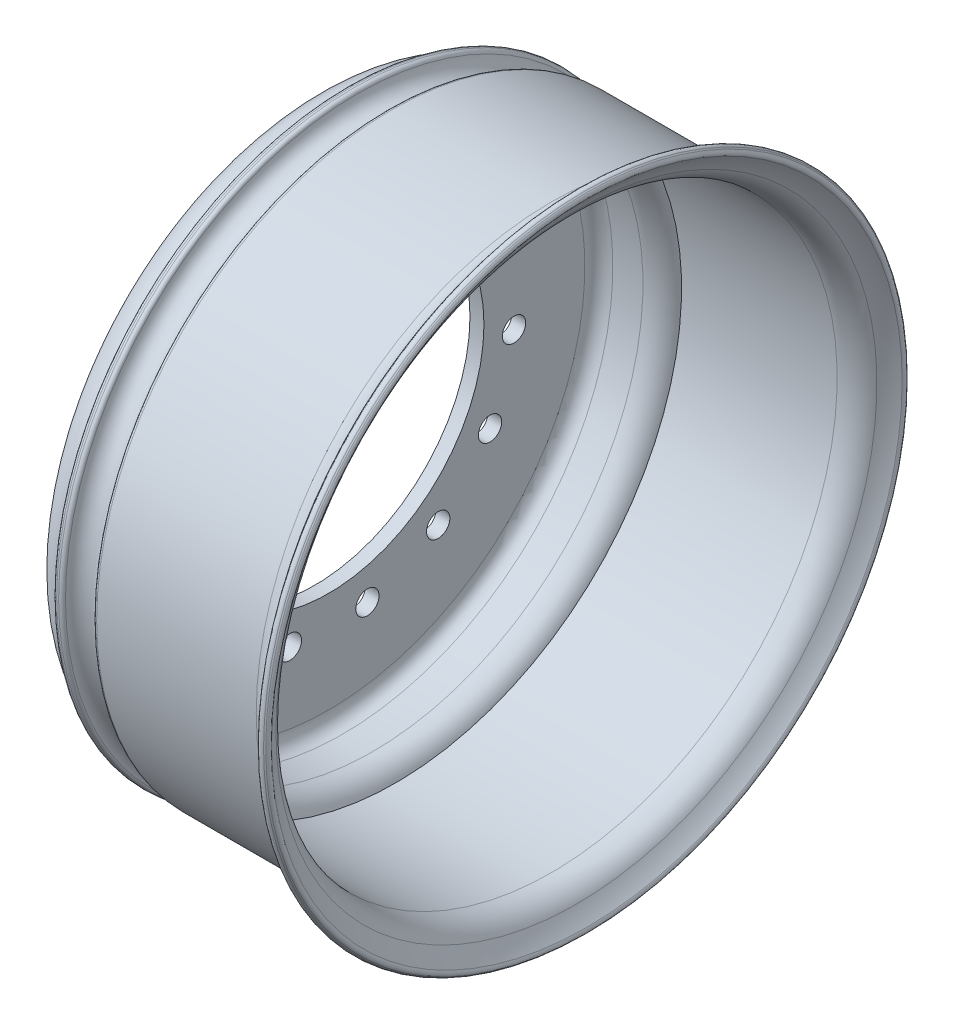
ISO-10303-21;
HEADER;
FILE_DESCRIPTION(('STEP AP214'),'2;1');
FILE_NAME('part.step','',(''),(''),'','','');
FILE_SCHEMA(('AUTOMOTIVE_DESIGN { 1 0 10303 214 1 1 1 1 }'));
ENDSEC;
DATA;
#1=APPLICATION_CONTEXT('core data for automotive mechanical design processes');
#2=APPLICATION_PROTOCOL_DEFINITION('international standard','automotive_design',2000,#1);
#3=PRODUCT_CONTEXT('',#1,'mechanical');
#4=PRODUCT('Part','Part','',(#3));
#5=PRODUCT_RELATED_PRODUCT_CATEGORY('part','',(#4));
#6=PRODUCT_DEFINITION_FORMATION('','',#4);
#7=PRODUCT_DEFINITION_CONTEXT('part definition',#1,'design');
#8=PRODUCT_DEFINITION('design','',#6,#7);
#9=PRODUCT_DEFINITION_SHAPE('','',#8);
#10=(LENGTH_UNIT() NAMED_UNIT(*) SI_UNIT(.MILLI.,.METRE.));
#11=(NAMED_UNIT(*) PLANE_ANGLE_UNIT() SI_UNIT($,.RADIAN.));
#12=(NAMED_UNIT(*) SI_UNIT($,.STERADIAN.) SOLID_ANGLE_UNIT());
#13=UNCERTAINTY_MEASURE_WITH_UNIT(LENGTH_MEASURE(1.E-05),#10,'distance_accuracy_value','');
#14=(GEOMETRIC_REPRESENTATION_CONTEXT(3) GLOBAL_UNCERTAINTY_ASSIGNED_CONTEXT((#13)) GLOBAL_UNIT_ASSIGNED_CONTEXT((#10,
#11,#12)) REPRESENTATION_CONTEXT('',''));
#15=CARTESIAN_POINT('',(0.,0.,0.));
#16=DIRECTION('',(0.,0.,1.));
#17=DIRECTION('',(1.,0.,0.));
#18=AXIS2_PLACEMENT_3D('',#15,#16,#17);
#19=CARTESIAN_POINT('',(0.,184.,0.));
#20=DIRECTION('',(1.,0.,0.));
#21=DIRECTION('',(0.,0.,-1.));
#22=AXIS2_PLACEMENT_3D('',#19,#20,#21);
#23=PLANE('',#22);
#24=CARTESIAN_POINT('',(0.,0.,0.));
#25=DIRECTION('',(1.,0.,0.));
#26=DIRECTION('',(0.,0.,-1.));
#27=AXIS2_PLACEMENT_3D('',#24,#25,#26);
#28=CIRCLE('',#27,187.5);
#29=CARTESIAN_POINT('',(0.,0.,-187.5));
#30=VERTEX_POINT('',#29);
#31=EDGE_CURVE('E44',#30,#30,#28,.F.);
#32=ORIENTED_EDGE('',*,*,#31,.T.);
#33=EDGE_LOOP('',(#32));
#34=FACE_BOUND('',#33,.T.);
#35=CARTESIAN_POINT('',(0.,0.,0.));
#36=DIRECTION('',(-1.,0.,0.));
#37=DIRECTION('',(0.,0.,1.));
#38=AXIS2_PLACEMENT_3D('',#35,#36,#37);
#39=CIRCLE('',#38,184.);
#40=CARTESIAN_POINT('',(0.,0.,184.));
#41=VERTEX_POINT('',#40);
#42=EDGE_CURVE('E84',#41,#41,#39,.T.);
#43=ORIENTED_EDGE('',*,*,#42,.F.);
#44=EDGE_LOOP('',(#43));
#45=FACE_BOUND('',#44,.T.);
#46=ADVANCED_FACE('F36',(#34,#45),#23,.F.);
#47=CARTESIAN_POINT('',(0.,0.,0.));
#48=DIRECTION('',(-1.,0.,0.));
#49=DIRECTION('',(0.,0.,1.));
#50=AXIS2_PLACEMENT_3D('',#47,#48,#49);
#51=CYLINDRICAL_SURFACE('',#50,184.);
#52=CARTESIAN_POINT('',(1.16760302580868,0.,0.));
#53=DIRECTION('',(-1.,0.,0.));
#54=DIRECTION('',(0.,0.,1.));
#55=AXIS2_PLACEMENT_3D('',#52,#53,#54);
#56=CIRCLE('',#55,184.);
#57=CARTESIAN_POINT('',(1.16760302580868,0.,184.));
#58=VERTEX_POINT('',#57);
#59=EDGE_CURVE('E94',#58,#58,#56,.T.);
#60=ORIENTED_EDGE('',*,*,#59,.F.);
#61=EDGE_LOOP('',(#60));
#62=FACE_BOUND('',#61,.T.);
#63=ORIENTED_EDGE('',*,*,#42,.T.);
#64=EDGE_LOOP('',(#63));
#65=FACE_BOUND('',#64,.T.);
#66=ADVANCED_FACE('F305',(#62,#65),#51,.F.);
#67=CARTESIAN_POINT('',(16.,0.,0.));
#68=DIRECTION('',(-1.,0.,0.));
#69=DIRECTION('',(0.,0.,1.));
#70=AXIS2_PLACEMENT_3D('',#67,#68,#69);
#71=TOROIDAL_SURFACE('',#70,190.,16.);
#72=CARTESIAN_POINT('',(1.61250543006184,0.,0.));
#73=DIRECTION('',(-1.,0.,0.));
#74=DIRECTION('',(0.,0.,1.));
#75=AXIS2_PLACEMENT_3D('',#72,#73,#74);
#76=CIRCLE('',#75,183.);
#77=CARTESIAN_POINT('',(1.61250543006184,0.,183.));
#78=VERTEX_POINT('',#77);
#79=EDGE_CURVE('E98',#78,#78,#76,.T.);
#80=ORIENTED_EDGE('',*,*,#79,.F.);
#81=EDGE_LOOP('',(#80));
#82=FACE_BOUND('',#81,.T.);
#83=ORIENTED_EDGE('',*,*,#59,.T.);
#84=EDGE_LOOP('',(#83));
#85=FACE_BOUND('',#84,.T.);
#86=ADVANCED_FACE('F299',(#82,#85),#71,.T.);
#87=CARTESIAN_POINT('',(0.,0.,0.));
#88=DIRECTION('',(-1.,0.,0.));
#89=DIRECTION('',(0.,0.,1.));
#90=AXIS2_PLACEMENT_3D('',#87,#88,#89);
#91=CYLINDRICAL_SURFACE('',#90,183.);
#92=CARTESIAN_POINT('',(-3.38749456993816,0.,0.));
#93=DIRECTION('',(-1.,0.,0.));
#94=DIRECTION('',(0.,0.,1.));
#95=AXIS2_PLACEMENT_3D('',#92,#93,#94);
#96=CIRCLE('',#95,183.);
#97=CARTESIAN_POINT('',(-3.38749456993816,0.,183.));
#98=VERTEX_POINT('',#97);
#99=EDGE_CURVE('E102',#98,#98,#96,.T.);
#100=ORIENTED_EDGE('',*,*,#99,.F.);
#101=EDGE_LOOP('',(#100));
#102=FACE_BOUND('',#101,.T.);
#103=ORIENTED_EDGE('',*,*,#79,.T.);
#104=EDGE_LOOP('',(#103));
#105=FACE_BOUND('',#104,.T.);
#106=ADVANCED_FACE('F293',(#102,#105),#91,.T.);
#107=CARTESIAN_POINT('',(-3.38749456993816,0.,0.));
#108=DIRECTION('',(-1.,0.,0.));
#109=DIRECTION('',(0.,0.,1.));
#110=AXIS2_PLACEMENT_3D('',#107,#108,#109);
#111=TOROIDAL_SURFACE('',#110,165.,18.);
#112=CARTESIAN_POINT('',(-21.3874945699382,0.,0.));
#113=DIRECTION('',(-1.,0.,0.));
#114=DIRECTION('',(0.,0.,1.));
#115=AXIS2_PLACEMENT_3D('',#112,#113,#114);
#116=CIRCLE('',#115,165.);
#117=CARTESIAN_POINT('',(-21.3874945699382,0.,165.));
#118=VERTEX_POINT('',#117);
#119=EDGE_CURVE('E106',#118,#118,#116,.T.);
#120=ORIENTED_EDGE('',*,*,#119,.F.);
#121=EDGE_LOOP('',(#120));
#122=FACE_BOUND('',#121,.T.);
#123=ORIENTED_EDGE('',*,*,#99,.T.);
#124=EDGE_LOOP('',(#123));
#125=FACE_BOUND('',#124,.T.);
#126=ADVANCED_FACE('F272',(#122,#125),#111,.T.);
#127=CARTESIAN_POINT('',(-21.3874945699382,100.,0.));
#128=DIRECTION('',(1.,0.,0.));
#129=DIRECTION('',(0.,0.,-1.));
#130=AXIS2_PLACEMENT_3D('',#127,#128,#129);
#131=PLANE('',#130);
#132=CARTESIAN_POINT('',(-21.3874945699382,80.2956727630628,-89.1773790572874));
#133=DIRECTION('',(-1.,0.,0.));
#134=DIRECTION('',(0.,0.743144825477395,0.669130606358857));
#135=AXIS2_PLACEMENT_3D('',#132,#133,#134);
#136=CIRCLE('',#135,7.5);
#137=CARTESIAN_POINT('',(-21.3874945699382,85.8692589541433,-84.158899509596));
#138=VERTEX_POINT('',#137);
#139=EDGE_CURVE('E215',#138,#138,#136,.T.);
#140=ORIENTED_EDGE('',*,*,#139,.F.);
#141=EDGE_LOOP('',(#140));
#142=FACE_BOUND('',#141,.T.);
#143=CARTESIAN_POINT('',(-21.3874945699382,37.0820393249934,-114.126781955419));
#144=DIRECTION('',(-1.,0.,0.));
#145=DIRECTION('',(0.,0.951056516295154,0.309016994374945));
#146=AXIS2_PLACEMENT_3D('',#143,#144,#145);
#147=CIRCLE('',#146,7.5);
#148=CARTESIAN_POINT('',(-21.3874945699382,44.2149631972071,-111.809154497606));
#149=VERTEX_POINT('',#148);
#150=EDGE_CURVE('E207',#149,#149,#147,.T.);
#151=ORIENTED_EDGE('',*,*,#150,.F.);
#152=EDGE_LOOP('',(#151));
#153=FACE_BOUND('',#152,.T.);
#154=CARTESIAN_POINT('',(-21.3874945699382,-12.5434155921188,-119.342627444193));
#155=DIRECTION('',(-1.,0.,0.));
#156=DIRECTION('',(0.,0.994521895368273,-0.104528463267657));
#157=AXIS2_PLACEMENT_3D('',#154,#155,#156);
#158=CIRCLE('',#157,7.5);
#159=CARTESIAN_POINT('',(-21.3874945699382,-5.08450137685675,-120.1265909187));
#160=VERTEX_POINT('',#159);
#161=EDGE_CURVE('E199',#160,#160,#158,.T.);
#162=ORIENTED_EDGE('',*,*,#161,.F.);
#163=EDGE_LOOP('',(#162));
#164=FACE_BOUND('',#163,.T.);
#165=CARTESIAN_POINT('',(-21.3874945699382,-60.0000000000004,-103.923048454132));
#166=DIRECTION('',(-1.,0.,0.));
#167=DIRECTION('',(0.,0.866025403784437,-0.500000000000003));
#168=AXIS2_PLACEMENT_3D('',#165,#166,#167);
#169=CIRCLE('',#168,7.5);
#170=CARTESIAN_POINT('',(-21.3874945699382,-53.5048094716171,-107.673048454132));
#171=VERTEX_POINT('',#170);
#172=EDGE_CURVE('E191',#171,#171,#169,.T.);
#173=ORIENTED_EDGE('',*,*,#172,.F.);
#174=EDGE_LOOP('',(#173));
#175=FACE_BOUND('',#174,.T.);
#176=CARTESIAN_POINT('',(-21.3874945699382,-97.082039324994,-70.5342302750963));
#177=DIRECTION('',(-1.,0.,0.));
#178=DIRECTION('',(0.,0.587785252292469,-0.80901699437495));
#179=AXIS2_PLACEMENT_3D('',#176,#177,#178);
#180=CIRCLE('',#179,7.5);
#181=CARTESIAN_POINT('',(-21.3874945699382,-92.6736499328005,-76.6018577329084));
#182=VERTEX_POINT('',#181);
#183=EDGE_CURVE('E183',#182,#182,#180,.T.);
#184=ORIENTED_EDGE('',*,*,#183,.F.);
#185=EDGE_LOOP('',(#184));
#186=FACE_BOUND('',#185,.T.);
#187=CARTESIAN_POINT('',(-21.3874945699382,-117.377712088057,-24.9494028981304));
#188=DIRECTION('',(-1.,0.,0.));
#189=DIRECTION('',(0.,0.207911690817754,-0.978147600733807));
#190=AXIS2_PLACEMENT_3D('',#187,#188,#189);
#191=CIRCLE('',#190,7.5);
#192=CARTESIAN_POINT('',(-21.3874945699382,-115.818374406924,-32.285509903634));
#193=VERTEX_POINT('',#192);
#194=EDGE_CURVE('E175',#193,#193,#191,.T.);
#195=ORIENTED_EDGE('',*,*,#194,.F.);
#196=EDGE_LOOP('',(#195));
#197=FACE_BOUND('',#196,.T.);
#198=CARTESIAN_POINT('',(-21.3874945699382,-117.377712088057,24.9494028981319));
#199=DIRECTION('',(-1.,0.,0.));
#200=DIRECTION('',(0.,-0.207911690817766,-0.978147600733804));
#201=AXIS2_PLACEMENT_3D('',#198,#199,#200);
#202=CIRCLE('',#201,7.5);
#203=CARTESIAN_POINT('',(-21.3874945699382,-118.93704976919,17.6132958926283));
#204=VERTEX_POINT('',#203);
#205=EDGE_CURVE('E165',#204,#204,#202,.T.);
#206=ORIENTED_EDGE('',*,*,#205,.F.);
#207=EDGE_LOOP('',(#206));
#208=FACE_BOUND('',#207,.T.);
#209=CARTESIAN_POINT('',(-21.3874945699382,-97.0820393249932,70.5342302750974));
#210=DIRECTION('',(-1.,0.,0.));
#211=DIRECTION('',(0.,-0.587785252292479,-0.809016994374943));
#212=AXIS2_PLACEMENT_3D('',#209,#210,#211);
#213=CIRCLE('',#212,7.5);
#214=CARTESIAN_POINT('',(-21.3874945699382,-101.490428717187,64.4666028172854));
#215=VERTEX_POINT('',#214);
#216=EDGE_CURVE('E166',#215,#215,#213,.T.);
#217=ORIENTED_EDGE('',*,*,#216,.F.);
#218=EDGE_LOOP('',(#217));
#219=FACE_BOUND('',#218,.T.);
#220=CARTESIAN_POINT('',(-21.3874945699382,-59.9999999999992,103.923048454133));
#221=DIRECTION('',(-1.,0.,0.));
#222=DIRECTION('',(0.,-0.866025403784443,-0.499999999999994));
#223=AXIS2_PLACEMENT_3D('',#220,#221,#222);
#224=CIRCLE('',#223,7.5);
#225=CARTESIAN_POINT('',(-21.3874945699382,-66.4951905283826,100.173048454133));
#226=VERTEX_POINT('',#225);
#227=EDGE_CURVE('E254',#226,#226,#224,.T.);
#228=ORIENTED_EDGE('',*,*,#227,.F.);
#229=EDGE_LOOP('',(#228));
#230=FACE_BOUND('',#229,.T.);
#231=CARTESIAN_POINT('',(-21.3874945699382,-12.5434155921173,119.342627444193));
#232=DIRECTION('',(-1.,0.,0.));
#233=DIRECTION('',(0.,-0.994521895368274,-0.104528463267645));
#234=AXIS2_PLACEMENT_3D('',#231,#232,#233);
#235=CIRCLE('',#234,7.5);
#236=CARTESIAN_POINT('',(-21.3874945699382,-20.0023298073794,118.558663969686));
#237=VERTEX_POINT('',#236);
#238=EDGE_CURVE('E246',#237,#237,#235,.T.);
#239=ORIENTED_EDGE('',*,*,#238,.F.);
#240=EDGE_LOOP('',(#239));
#241=FACE_BOUND('',#240,.T.);
#242=CARTESIAN_POINT('',(-21.3874945699382,37.0820393249948,114.126781955418));
#243=DIRECTION('',(-1.,0.,0.));
#244=DIRECTION('',(0.,-0.951056516295151,0.309016994374957));
#245=AXIS2_PLACEMENT_3D('',#242,#243,#244);
#246=CIRCLE('',#245,7.5);
#247=CARTESIAN_POINT('',(-21.3874945699382,29.9491154527812,116.44440941323));
#248=VERTEX_POINT('',#247);
#249=EDGE_CURVE('E238',#248,#248,#246,.T.);
#250=ORIENTED_EDGE('',*,*,#249,.F.);
#251=EDGE_LOOP('',(#250));
#252=FACE_BOUND('',#251,.T.);
#253=CARTESIAN_POINT('',(-21.3874945699382,80.2956727630639,89.1773790572865));
#254=DIRECTION('',(-1.,0.,0.));
#255=DIRECTION('',(0.,-0.743144825477387,0.669130606358866));
#256=AXIS2_PLACEMENT_3D('',#253,#254,#255);
#257=CIRCLE('',#256,7.5);
#258=CARTESIAN_POINT('',(-21.3874945699382,74.7220865719835,94.195858604978));
#259=VERTEX_POINT('',#258);
#260=EDGE_CURVE('E229',#259,#259,#257,.T.);
#261=ORIENTED_EDGE('',*,*,#260,.F.);
#262=EDGE_LOOP('',(#261));
#263=FACE_BOUND('',#262,.T.);
#264=CARTESIAN_POINT('',(-21.3874945699382,109.625454917113,48.8083971690947));
#265=DIRECTION('',(-1.,0.,0.));
#266=DIRECTION('',(0.,-0.40673664307579,0.913545457642606));
#267=AXIS2_PLACEMENT_3D('',#264,#265,#266);
#268=CIRCLE('',#267,7.5);
#269=CARTESIAN_POINT('',(-21.3874945699382,106.574930094044,55.6599881014143));
#270=VERTEX_POINT('',#269);
#271=EDGE_CURVE('E230',#270,#270,#268,.T.);
#272=ORIENTED_EDGE('',*,*,#271,.F.);
#273=EDGE_LOOP('',(#272));
#274=FACE_BOUND('',#273,.T.);
#275=CARTESIAN_POINT('',(-21.3874945699382,109.625454917112,-48.8083971690961));
#276=DIRECTION('',(-1.,0.,0.));
#277=DIRECTION('',(0.,0.406736643075801,0.913545457642601));
#278=AXIS2_PLACEMENT_3D('',#275,#276,#277);
#279=CIRCLE('',#278,7.5);
#280=CARTESIAN_POINT('',(-21.3874945699382,112.675979740181,-41.9568062367766));
#281=VERTEX_POINT('',#280);
#282=EDGE_CURVE('E156',#281,#281,#279,.T.);
#283=ORIENTED_EDGE('',*,*,#282,.F.);
#284=EDGE_LOOP('',(#283));
#285=FACE_BOUND('',#284,.T.);
#286=CARTESIAN_POINT('',(-21.3874945699382,120.,0.));
#287=DIRECTION('',(-1.,0.,0.));
#288=DIRECTION('',(0.,0.,1.));
#289=AXIS2_PLACEMENT_3D('',#286,#287,#288);
#290=CIRCLE('',#289,7.5);
#291=CARTESIAN_POINT('',(-21.3874945699382,120.,7.5));
#292=VERTEX_POINT('',#291);
#293=EDGE_CURVE('E90',#292,#292,#290,.T.);
#294=ORIENTED_EDGE('',*,*,#293,.F.);
#295=EDGE_LOOP('',(#294));
#296=FACE_BOUND('',#295,.T.);
#297=CARTESIAN_POINT('',(-21.3874945699382,0.,0.));
#298=DIRECTION('',(-1.,0.,0.));
#299=DIRECTION('',(0.,0.,1.));
#300=AXIS2_PLACEMENT_3D('',#297,#298,#299);
#301=CIRCLE('',#300,100.);
#302=CARTESIAN_POINT('',(-21.3874945699382,0.,100.));
#303=VERTEX_POINT('',#302);
#304=EDGE_CURVE('E110',#303,#303,#301,.T.);
#305=ORIENTED_EDGE('',*,*,#304,.F.);
#306=EDGE_LOOP('',(#305));
#307=FACE_BOUND('',#306,.T.);
#308=ORIENTED_EDGE('',*,*,#119,.T.);
#309=EDGE_LOOP('',(#308));
#310=FACE_BOUND('',#309,.T.);
#311=ADVANCED_FACE('F268',(#142,#153,#164,#175,#186,#197,#208,#219,#230,#241,#252,#263,#274,
#285,#296,#307,#310),#131,.F.);
#312=CARTESIAN_POINT('',(0.,0.,0.));
#313=DIRECTION('',(-1.,0.,0.));
#314=DIRECTION('',(0.,0.,1.));
#315=AXIS2_PLACEMENT_3D('',#312,#313,#314);
#316=CYLINDRICAL_SURFACE('',#315,100.);
#317=CARTESIAN_POINT('',(-12.3874945699381,0.,0.));
#318=DIRECTION('',(-1.,0.,0.));
#319=DIRECTION('',(0.,0.,1.));
#320=AXIS2_PLACEMENT_3D('',#317,#318,#319);
#321=CIRCLE('',#320,100.);
#322=CARTESIAN_POINT('',(-12.3874945699381,0.,100.));
#323=VERTEX_POINT('',#322);
#324=EDGE_CURVE('E114',#323,#323,#321,.T.);
#325=ORIENTED_EDGE('',*,*,#324,.F.);
#326=EDGE_LOOP('',(#325));
#327=FACE_BOUND('',#326,.T.);
#328=ORIENTED_EDGE('',*,*,#304,.T.);
#329=EDGE_LOOP('',(#328));
#330=FACE_BOUND('',#329,.T.);
#331=ADVANCED_FACE('F271',(#327,#330),#316,.F.);
#332=CARTESIAN_POINT('',(-12.3874945699382,165.,0.));
#333=DIRECTION('',(-1.,0.,0.));
#334=DIRECTION('',(0.,0.,1.));
#335=AXIS2_PLACEMENT_3D('',#332,#333,#334);
#336=PLANE('',#335);
#337=CARTESIAN_POINT('',(-12.3874945699382,80.2956727630628,-89.1773790572874));
#338=DIRECTION('',(-1.,0.,0.));
#339=DIRECTION('',(0.,0.743144825477395,0.669130606358857));
#340=AXIS2_PLACEMENT_3D('',#337,#338,#339);
#341=CIRCLE('',#340,7.5);
#342=CARTESIAN_POINT('',(-12.3874945699382,85.8692589541433,-84.158899509596));
#343=VERTEX_POINT('',#342);
#344=EDGE_CURVE('E160',#343,#343,#341,.T.);
#345=ORIENTED_EDGE('',*,*,#344,.T.);
#346=EDGE_LOOP('',(#345));
#347=FACE_BOUND('',#346,.T.);
#348=CARTESIAN_POINT('',(-12.3874945699382,37.0820393249934,-114.126781955419));
#349=DIRECTION('',(-1.,0.,0.));
#350=DIRECTION('',(0.,0.951056516295154,0.309016994374945));
#351=AXIS2_PLACEMENT_3D('',#348,#349,#350);
#352=CIRCLE('',#351,7.5);
#353=CARTESIAN_POINT('',(-12.3874945699382,44.2149631972071,-111.809154497606));
#354=VERTEX_POINT('',#353);
#355=EDGE_CURVE('E211',#354,#354,#352,.T.);
#356=ORIENTED_EDGE('',*,*,#355,.T.);
#357=EDGE_LOOP('',(#356));
#358=FACE_BOUND('',#357,.T.);
#359=CARTESIAN_POINT('',(-12.3874945699382,-12.5434155921188,-119.342627444193));
#360=DIRECTION('',(-1.,0.,0.));
#361=DIRECTION('',(0.,0.994521895368273,-0.104528463267657));
#362=AXIS2_PLACEMENT_3D('',#359,#360,#361);
#363=CIRCLE('',#362,7.5);
#364=CARTESIAN_POINT('',(-12.3874945699382,-5.08450137685675,-120.1265909187));
#365=VERTEX_POINT('',#364);
#366=EDGE_CURVE('E203',#365,#365,#363,.T.);
#367=ORIENTED_EDGE('',*,*,#366,.T.);
#368=EDGE_LOOP('',(#367));
#369=FACE_BOUND('',#368,.T.);
#370=CARTESIAN_POINT('',(-12.3874945699382,-60.0000000000004,-103.923048454132));
#371=DIRECTION('',(-1.,0.,0.));
#372=DIRECTION('',(0.,0.866025403784437,-0.500000000000003));
#373=AXIS2_PLACEMENT_3D('',#370,#371,#372);
#374=CIRCLE('',#373,7.5);
#375=CARTESIAN_POINT('',(-12.3874945699382,-53.5048094716171,-107.673048454132));
#376=VERTEX_POINT('',#375);
#377=EDGE_CURVE('E195',#376,#376,#374,.T.);
#378=ORIENTED_EDGE('',*,*,#377,.T.);
#379=EDGE_LOOP('',(#378));
#380=FACE_BOUND('',#379,.T.);
#381=CARTESIAN_POINT('',(-12.3874945699382,-97.082039324994,-70.5342302750963));
#382=DIRECTION('',(-1.,0.,0.));
#383=DIRECTION('',(0.,0.587785252292469,-0.80901699437495));
#384=AXIS2_PLACEMENT_3D('',#381,#382,#383);
#385=CIRCLE('',#384,7.5);
#386=CARTESIAN_POINT('',(-12.3874945699382,-92.6736499328005,-76.6018577329084));
#387=VERTEX_POINT('',#386);
#388=EDGE_CURVE('E187',#387,#387,#385,.T.);
#389=ORIENTED_EDGE('',*,*,#388,.T.);
#390=EDGE_LOOP('',(#389));
#391=FACE_BOUND('',#390,.T.);
#392=CARTESIAN_POINT('',(-12.3874945699382,-117.377712088057,-24.9494028981304));
#393=DIRECTION('',(-1.,0.,0.));
#394=DIRECTION('',(0.,0.207911690817754,-0.978147600733807));
#395=AXIS2_PLACEMENT_3D('',#392,#393,#394);
#396=CIRCLE('',#395,7.5);
#397=CARTESIAN_POINT('',(-12.3874945699382,-115.818374406924,-32.285509903634));
#398=VERTEX_POINT('',#397);
#399=EDGE_CURVE('E179',#398,#398,#396,.T.);
#400=ORIENTED_EDGE('',*,*,#399,.T.);
#401=EDGE_LOOP('',(#400));
#402=FACE_BOUND('',#401,.T.);
#403=CARTESIAN_POINT('',(-12.3874945699382,-117.377712088057,24.9494028981319));
#404=DIRECTION('',(-1.,0.,0.));
#405=DIRECTION('',(0.,-0.207911690817766,-0.978147600733804));
#406=AXIS2_PLACEMENT_3D('',#403,#404,#405);
#407=CIRCLE('',#406,7.5);
#408=CARTESIAN_POINT('',(-12.3874945699382,-118.93704976919,17.6132958926283));
#409=VERTEX_POINT('',#408);
#410=EDGE_CURVE('E171',#409,#409,#407,.T.);
#411=ORIENTED_EDGE('',*,*,#410,.T.);
#412=EDGE_LOOP('',(#411));
#413=FACE_BOUND('',#412,.T.);
#414=CARTESIAN_POINT('',(-12.3874945699382,-97.0820393249932,70.5342302750974));
#415=DIRECTION('',(-1.,0.,0.));
#416=DIRECTION('',(0.,-0.587785252292479,-0.809016994374943));
#417=AXIS2_PLACEMENT_3D('',#414,#415,#416);
#418=CIRCLE('',#417,7.5);
#419=CARTESIAN_POINT('',(-12.3874945699382,-101.490428717187,64.4666028172854));
#420=VERTEX_POINT('',#419);
#421=EDGE_CURVE('E161',#420,#420,#418,.T.);
#422=ORIENTED_EDGE('',*,*,#421,.T.);
#423=EDGE_LOOP('',(#422));
#424=FACE_BOUND('',#423,.T.);
#425=CARTESIAN_POINT('',(-12.3874945699382,-59.9999999999992,103.923048454133));
#426=DIRECTION('',(-1.,0.,0.));
#427=DIRECTION('',(0.,-0.866025403784443,-0.499999999999994));
#428=AXIS2_PLACEMENT_3D('',#425,#426,#427);
#429=CIRCLE('',#428,7.5);
#430=CARTESIAN_POINT('',(-12.3874945699382,-66.4951905283826,100.173048454133));
#431=VERTEX_POINT('',#430);
#432=EDGE_CURVE('E170',#431,#431,#429,.T.);
#433=ORIENTED_EDGE('',*,*,#432,.T.);
#434=EDGE_LOOP('',(#433));
#435=FACE_BOUND('',#434,.T.);
#436=CARTESIAN_POINT('',(-12.3874945699382,-12.5434155921173,119.342627444193));
#437=DIRECTION('',(-1.,0.,0.));
#438=DIRECTION('',(0.,-0.994521895368274,-0.104528463267645));
#439=AXIS2_PLACEMENT_3D('',#436,#437,#438);
#440=CIRCLE('',#439,7.5);
#441=CARTESIAN_POINT('',(-12.3874945699382,-20.0023298073794,118.558663969686));
#442=VERTEX_POINT('',#441);
#443=EDGE_CURVE('E250',#442,#442,#440,.T.);
#444=ORIENTED_EDGE('',*,*,#443,.T.);
#445=EDGE_LOOP('',(#444));
#446=FACE_BOUND('',#445,.T.);
#447=CARTESIAN_POINT('',(-12.3874945699382,37.0820393249948,114.126781955418));
#448=DIRECTION('',(-1.,0.,0.));
#449=DIRECTION('',(0.,-0.951056516295151,0.309016994374957));
#450=AXIS2_PLACEMENT_3D('',#447,#448,#449);
#451=CIRCLE('',#450,7.5);
#452=CARTESIAN_POINT('',(-12.3874945699382,29.9491154527812,116.44440941323));
#453=VERTEX_POINT('',#452);
#454=EDGE_CURVE('E242',#453,#453,#451,.T.);
#455=ORIENTED_EDGE('',*,*,#454,.T.);
#456=EDGE_LOOP('',(#455));
#457=FACE_BOUND('',#456,.T.);
#458=CARTESIAN_POINT('',(-12.3874945699382,80.2956727630639,89.1773790572865));
#459=DIRECTION('',(-1.,0.,0.));
#460=DIRECTION('',(0.,-0.743144825477387,0.669130606358866));
#461=AXIS2_PLACEMENT_3D('',#458,#459,#460);
#462=CIRCLE('',#461,7.5);
#463=CARTESIAN_POINT('',(-12.3874945699382,74.7220865719835,94.195858604978));
#464=VERTEX_POINT('',#463);
#465=EDGE_CURVE('E234',#464,#464,#462,.T.);
#466=ORIENTED_EDGE('',*,*,#465,.T.);
#467=EDGE_LOOP('',(#466));
#468=FACE_BOUND('',#467,.T.);
#469=CARTESIAN_POINT('',(-12.3874945699382,109.625454917113,48.8083971690947));
#470=DIRECTION('',(-1.,0.,0.));
#471=DIRECTION('',(0.,-0.40673664307579,0.913545457642606));
#472=AXIS2_PLACEMENT_3D('',#469,#470,#471);
#473=CIRCLE('',#472,7.5);
#474=CARTESIAN_POINT('',(-12.3874945699382,106.574930094044,55.6599881014143));
#475=VERTEX_POINT('',#474);
#476=EDGE_CURVE('E225',#475,#475,#473,.T.);
#477=ORIENTED_EDGE('',*,*,#476,.T.);
#478=EDGE_LOOP('',(#477));
#479=FACE_BOUND('',#478,.T.);
#480=CARTESIAN_POINT('',(-12.3874945699382,109.625454917112,-48.8083971690961));
#481=DIRECTION('',(-1.,0.,0.));
#482=DIRECTION('',(0.,0.406736643075801,0.913545457642601));
#483=AXIS2_PLACEMENT_3D('',#480,#481,#482);
#484=CIRCLE('',#483,7.5);
#485=CARTESIAN_POINT('',(-12.3874945699382,112.675979740181,-41.9568062367766));
#486=VERTEX_POINT('',#485);
#487=EDGE_CURVE('E152',#486,#486,#484,.T.);
#488=ORIENTED_EDGE('',*,*,#487,.T.);
#489=EDGE_LOOP('',(#488));
#490=FACE_BOUND('',#489,.T.);
#491=CARTESIAN_POINT('',(-12.3874945699382,120.,0.));
#492=DIRECTION('',(-1.,0.,0.));
#493=DIRECTION('',(0.,0.,1.));
#494=AXIS2_PLACEMENT_3D('',#491,#492,#493);
#495=CIRCLE('',#494,7.5);
#496=CARTESIAN_POINT('',(-12.3874945699382,120.,7.5));
#497=VERTEX_POINT('',#496);
#498=EDGE_CURVE('E85',#497,#497,#495,.T.);
#499=ORIENTED_EDGE('',*,*,#498,.T.);
#500=EDGE_LOOP('',(#499));
#501=FACE_BOUND('',#500,.T.);
#502=CARTESIAN_POINT('',(-12.3874945699382,0.,0.));
#503=DIRECTION('',(-1.,0.,0.));
#504=DIRECTION('',(0.,0.,1.));
#505=AXIS2_PLACEMENT_3D('',#502,#503,#504);
#506=CIRCLE('',#505,165.);
#507=CARTESIAN_POINT('',(-12.3874945699382,0.,165.));
#508=VERTEX_POINT('',#507);
#509=EDGE_CURVE('E118',#508,#508,#506,.T.);
#510=ORIENTED_EDGE('',*,*,#509,.F.);
#511=EDGE_LOOP('',(#510));
#512=FACE_BOUND('',#511,.T.);
#513=ORIENTED_EDGE('',*,*,#324,.T.);
#514=EDGE_LOOP('',(#513));
#515=FACE_BOUND('',#514,.T.);
#516=ADVANCED_FACE('F396',(#347,#358,#369,#380,#391,#402,#413,#424,#435,#446,#457,#468,#479,
#490,#501,#512,#515),#336,.F.);
#517=CARTESIAN_POINT('',(-3.38749456993816,0.,0.));
#518=DIRECTION('',(-1.,0.,0.));
#519=DIRECTION('',(0.,0.,1.));
#520=AXIS2_PLACEMENT_3D('',#517,#518,#519);
#521=TOROIDAL_SURFACE('',#520,165.,9.00000000000001);
#522=CARTESIAN_POINT('',(-3.38749456993816,0.,0.));
#523=DIRECTION('',(-1.,0.,0.));
#524=DIRECTION('',(0.,0.,1.));
#525=AXIS2_PLACEMENT_3D('',#522,#523,#524);
#526=CIRCLE('',#525,174.);
#527=CARTESIAN_POINT('',(-3.38749456993816,0.,174.));
#528=VERTEX_POINT('',#527);
#529=EDGE_CURVE('E122',#528,#528,#526,.T.);
#530=ORIENTED_EDGE('',*,*,#529,.F.);
#531=EDGE_LOOP('',(#530));
#532=FACE_BOUND('',#531,.T.);
#533=ORIENTED_EDGE('',*,*,#509,.T.);
#534=EDGE_LOOP('',(#533));
#535=FACE_BOUND('',#534,.T.);
#536=ADVANCED_FACE('F392',(#532,#535),#521,.F.);
#537=CARTESIAN_POINT('',(0.,0.,0.));
#538=DIRECTION('',(-1.,0.,0.));
#539=DIRECTION('',(0.,0.,1.));
#540=AXIS2_PLACEMENT_3D('',#537,#538,#539);
#541=CYLINDRICAL_SURFACE('',#540,174.);
#542=CARTESIAN_POINT('',(16.,0.,0.));
#543=DIRECTION('',(-1.,0.,0.));
#544=DIRECTION('',(0.,0.,1.));
#545=AXIS2_PLACEMENT_3D('',#542,#543,#544);
#546=CIRCLE('',#545,174.);
#547=CARTESIAN_POINT('',(16.,0.,174.));
#548=VERTEX_POINT('',#547);
#549=EDGE_CURVE('E126',#548,#548,#546,.T.);
#550=ORIENTED_EDGE('',*,*,#549,.F.);
#551=EDGE_LOOP('',(#550));
#552=FACE_BOUND('',#551,.T.);
#553=ORIENTED_EDGE('',*,*,#529,.T.);
#554=EDGE_LOOP('',(#553));
#555=FACE_BOUND('',#554,.T.);
#556=ADVANCED_FACE('F388',(#552,#555),#541,.F.);
#557=CARTESIAN_POINT('',(16.,0.,0.));
#558=DIRECTION('',(-1.,0.,0.));
#559=DIRECTION('',(0.,0.,1.));
#560=AXIS2_PLACEMENT_3D('',#557,#558,#559);
#561=TOROIDAL_SURFACE('',#560,190.,16.);
#562=CARTESIAN_POINT('',(30.8323969741913,0.,0.));
#563=DIRECTION('',(-1.,0.,0.));
#564=DIRECTION('',(0.,0.,1.));
#565=AXIS2_PLACEMENT_3D('',#562,#563,#564);
#566=CIRCLE('',#565,184.);
#567=CARTESIAN_POINT('',(30.8323969741913,0.,184.));
#568=VERTEX_POINT('',#567);
#569=EDGE_CURVE('E130',#568,#568,#566,.T.);
#570=ORIENTED_EDGE('',*,*,#569,.F.);
#571=EDGE_LOOP('',(#570));
#572=FACE_BOUND('',#571,.T.);
#573=ORIENTED_EDGE('',*,*,#549,.T.);
#574=EDGE_LOOP('',(#573));
#575=FACE_BOUND('',#574,.T.);
#576=ADVANCED_FACE('F384',(#572,#575),#561,.T.);
#577=CARTESIAN_POINT('',(0.,0.,0.));
#578=DIRECTION('',(-1.,0.,0.));
#579=DIRECTION('',(0.,0.,1.));
#580=AXIS2_PLACEMENT_3D('',#577,#578,#579);
#581=CYLINDRICAL_SURFACE('',#580,184.);
#582=CARTESIAN_POINT('',(131.,0.,0.));
#583=DIRECTION('',(-1.,0.,0.));
#584=DIRECTION('',(0.,0.,1.));
#585=AXIS2_PLACEMENT_3D('',#582,#583,#584);
#586=CIRCLE('',#585,184.);
#587=CARTESIAN_POINT('',(131.,0.,184.));
#588=VERTEX_POINT('',#587);
#589=EDGE_CURVE('E134',#588,#588,#586,.T.);
#590=ORIENTED_EDGE('',*,*,#589,.F.);
#591=EDGE_LOOP('',(#590));
#592=FACE_BOUND('',#591,.T.);
#593=ORIENTED_EDGE('',*,*,#569,.T.);
#594=EDGE_LOOP('',(#593));
#595=FACE_BOUND('',#594,.T.);
#596=ADVANCED_FACE('F380',(#592,#595),#581,.F.);
#597=CARTESIAN_POINT('',(131.,0.,0.));
#598=DIRECTION('',(-1.,0.,0.));
#599=DIRECTION('',(0.,0.,1.));
#600=AXIS2_PLACEMENT_3D('',#597,#598,#599);
#601=TOROIDAL_SURFACE('',#600,202.5,18.5);
#602=CARTESIAN_POINT('',(147.150740079478,0.,0.));
#603=DIRECTION('',(-1.,0.,0.));
#604=DIRECTION('',(0.,0.,1.));
#605=AXIS2_PLACEMENT_3D('',#602,#603,#604);
#606=CIRCLE('',#605,193.477605922753);
#607=CARTESIAN_POINT('',(147.150740079478,0.,193.477605922753));
#608=VERTEX_POINT('',#607);
#609=EDGE_CURVE('E138',#608,#608,#606,.T.);
#610=ORIENTED_EDGE('',*,*,#609,.F.);
#611=EDGE_LOOP('',(#610));
#612=FACE_BOUND('',#611,.T.);
#613=ORIENTED_EDGE('',*,*,#589,.T.);
#614=EDGE_LOOP('',(#613));
#615=FACE_BOUND('',#614,.T.);
#616=ADVANCED_FACE('F376',(#612,#615),#601,.T.);
#617=CARTESIAN_POINT('',(198.658505738355,0.,0.));
#618=DIRECTION('',(-1.,0.,0.));
#619=DIRECTION('',(0.,0.,1.));
#620=AXIS2_PLACEMENT_3D('',#617,#618,#619);
#621=TOROIDAL_SURFACE('',#620,164.703484270994,59.);
#622=CARTESIAN_POINT('',(153.804097954559,0.,0.));
#623=DIRECTION('',(1.,0.,0.));
#624=DIRECTION('',(0.,0.,-1.));
#625=AXIS2_PLACEMENT_3D('',#622,#623,#624);
#626=CIRCLE('',#625,203.032091111903);
#627=CARTESIAN_POINT('',(153.804097954559,0.,-203.032091111903));
#628=VERTEX_POINT('',#627);
#629=EDGE_CURVE('E72',#628,#628,#626,.T.);
#630=ORIENTED_EDGE('',*,*,#629,.T.);
#631=EDGE_LOOP('',(#630));
#632=FACE_BOUND('',#631,.T.);
#633=ORIENTED_EDGE('',*,*,#609,.T.);
#634=EDGE_LOOP('',(#633));
#635=FACE_BOUND('',#634,.T.);
#636=ADVANCED_FACE('F372',(#632,#635),#621,.F.);
#637=CARTESIAN_POINT('',(155.39924668354,0.,0.));
#638=DIRECTION('',(-1.,0.,0.));
#639=DIRECTION('',(0.,0.,1.));
#640=AXIS2_PLACEMENT_3D('',#637,#638,#639);
#641=CONICAL_SURFACE('',#640,204.823759768907,0.747769003171668);
#642=CARTESIAN_POINT('',(153.603499128886,0.,0.));
#643=DIRECTION('',(1.,0.,0.));
#644=DIRECTION('',(0.,0.,-1.));
#645=AXIS2_PLACEMENT_3D('',#642,#643,#644);
#646=CIRCLE('',#645,206.489204073586);
#647=CARTESIAN_POINT('',(153.603499128886,0.,-206.489204073586));
#648=VERTEX_POINT('',#647);
#649=EDGE_CURVE('E76',#648,#648,#646,.F.);
#650=ORIENTED_EDGE('',*,*,#649,.T.);
#651=EDGE_LOOP('',(#650));
#652=FACE_BOUND('',#651,.T.);
#653=CARTESIAN_POINT('',(152.869694516403,0.,0.));
#654=DIRECTION('',(1.,0.,0.));
#655=DIRECTION('',(0.,0.,-1.));
#656=AXIS2_PLACEMENT_3D('',#653,#654,#655);
#657=CIRCLE('',#656,207.169762267547);
#658=CARTESIAN_POINT('',(152.869694516403,0.,-207.169762267547));
#659=VERTEX_POINT('',#658);
#660=EDGE_CURVE('E80',#659,#659,#657,.T.);
#661=ORIENTED_EDGE('',*,*,#660,.T.);
#662=EDGE_LOOP('',(#661));
#663=FACE_BOUND('',#662,.T.);
#664=ADVANCED_FACE('F368',(#652,#663),#641,.T.);
#665=CARTESIAN_POINT('',(198.658505738355,0.,0.));
#666=DIRECTION('',(-1.,0.,0.));
#667=DIRECTION('',(0.,0.,1.));
#668=AXIS2_PLACEMENT_3D('',#665,#666,#667);
#669=TOROIDAL_SURFACE('',#668,164.703484270994,65.);
#670=CARTESIAN_POINT('',(149.270129926939,0.,0.));
#671=DIRECTION('',(1.,0.,0.));
#672=DIRECTION('',(0.,0.,-1.));
#673=AXIS2_PLACEMENT_3D('',#670,#671,#672);
#674=CIRCLE('',#673,206.962073157874);
#675=CARTESIAN_POINT('',(149.270129926939,0.,-206.962073157874));
#676=VERTEX_POINT('',#675);
#677=EDGE_CURVE('E68',#676,#676,#674,.F.);
#678=ORIENTED_EDGE('',*,*,#677,.T.);
#679=EDGE_LOOP('',(#678));
#680=FACE_BOUND('',#679,.T.);
#681=CARTESIAN_POINT('',(141.912662215864,0.,0.));
#682=DIRECTION('',(-1.,0.,0.));
#683=DIRECTION('',(0.,0.,1.));
#684=AXIS2_PLACEMENT_3D('',#681,#682,#683);
#685=CIRCLE('',#684,196.403787785644);
#686=CARTESIAN_POINT('',(141.912662215864,0.,196.403787785644));
#687=VERTEX_POINT('',#686);
#688=EDGE_CURVE('E142',#687,#687,#685,.T.);
#689=ORIENTED_EDGE('',*,*,#688,.F.);
#690=EDGE_LOOP('',(#689));
#691=FACE_BOUND('',#690,.T.);
#692=ADVANCED_FACE('F364',(#680,#691),#669,.T.);
#693=CARTESIAN_POINT('',(131.,0.,0.));
#694=DIRECTION('',(-1.,0.,0.));
#695=DIRECTION('',(0.,0.,1.));
#696=AXIS2_PLACEMENT_3D('',#693,#694,#695);
#697=TOROIDAL_SURFACE('',#696,202.5,12.5);
#698=CARTESIAN_POINT('',(131.,0.,0.));
#699=DIRECTION('',(-1.,0.,0.));
#700=DIRECTION('',(0.,0.,1.));
#701=AXIS2_PLACEMENT_3D('',#698,#699,#700);
#702=CIRCLE('',#701,190.);
#703=CARTESIAN_POINT('',(131.,0.,190.));
#704=VERTEX_POINT('',#703);
#705=EDGE_CURVE('E89',#704,#704,#702,.T.);
#706=ORIENTED_EDGE('',*,*,#705,.F.);
#707=EDGE_LOOP('',(#706));
#708=FACE_BOUND('',#707,.T.);
#709=ORIENTED_EDGE('',*,*,#688,.T.);
#710=EDGE_LOOP('',(#709));
#711=FACE_BOUND('',#710,.T.);
#712=ADVANCED_FACE('F361',(#708,#711),#697,.F.);
#713=CARTESIAN_POINT('',(0.,0.,0.));
#714=DIRECTION('',(-1.,0.,0.));
#715=DIRECTION('',(0.,0.,1.));
#716=AXIS2_PLACEMENT_3D('',#713,#714,#715);
#717=CYLINDRICAL_SURFACE('',#716,190.);
#718=CARTESIAN_POINT('',(28.2474487139159,0.,0.));
#719=DIRECTION('',(1.,0.,0.));
#720=DIRECTION('',(0.,0.,-1.));
#721=AXIS2_PLACEMENT_3D('',#718,#719,#720);
#722=CIRCLE('',#721,190.);
#723=CARTESIAN_POINT('',(28.2474487139159,0.,-190.));
#724=VERTEX_POINT('',#723);
#725=EDGE_CURVE('E10',#724,#724,#722,.T.);
#726=ORIENTED_EDGE('',*,*,#725,.T.);
#727=EDGE_LOOP('',(#726));
#728=FACE_BOUND('',#727,.T.);
#729=ORIENTED_EDGE('',*,*,#705,.T.);
#730=EDGE_LOOP('',(#729));
#731=FACE_BOUND('',#730,.T.);
#732=ADVANCED_FACE('F354',(#728,#731),#717,.T.);
#733=CARTESIAN_POINT('',(16.,0.,0.));
#734=DIRECTION('',(-1.,0.,0.));
#735=DIRECTION('',(0.,0.,1.));
#736=AXIS2_PLACEMENT_3D('',#733,#734,#735);
#737=TOROIDAL_SURFACE('',#736,190.,10.);
#738=CARTESIAN_POINT('',(6.20204102886253,0.,0.));
#739=DIRECTION('',(1.,0.,0.));
#740=DIRECTION('',(0.,0.,-1.));
#741=AXIS2_PLACEMENT_3D('',#738,#739,#740);
#742=CIRCLE('',#741,187.999999999999);
#743=CARTESIAN_POINT('',(6.20204102886253,0.,-187.999999999999));
#744=VERTEX_POINT('',#743);
#745=EDGE_CURVE('E49',#744,#744,#742,.T.);
#746=ORIENTED_EDGE('',*,*,#745,.T.);
#747=EDGE_LOOP('',(#746));
#748=FACE_BOUND('',#747,.T.);
#749=CARTESIAN_POINT('',(25.7979589711458,0.,0.));
#750=DIRECTION('',(-1.,0.,0.));
#751=DIRECTION('',(0.,0.,1.));
#752=AXIS2_PLACEMENT_3D('',#749,#750,#751);
#753=CIRCLE('',#752,187.999999999997);
#754=CARTESIAN_POINT('',(25.7979589711458,0.,187.999999999997));
#755=VERTEX_POINT('',#754);
#756=EDGE_CURVE('E54',#755,#755,#753,.T.);
#757=ORIENTED_EDGE('',*,*,#756,.T.);
#758=EDGE_LOOP('',(#757));
#759=FACE_BOUND('',#758,.T.);
#760=ADVANCED_FACE('F344',(#748,#759),#737,.F.);
#761=CARTESIAN_POINT('',(0.,0.,0.));
#762=DIRECTION('',(-1.,0.,0.));
#763=DIRECTION('',(0.,0.,1.));
#764=AXIS2_PLACEMENT_3D('',#761,#762,#763);
#765=CYLINDRICAL_SURFACE('',#764,190.);
#766=CARTESIAN_POINT('',(3.75255128608411,0.,0.));
#767=DIRECTION('',(1.,0.,0.));
#768=DIRECTION('',(0.,0.,-1.));
#769=AXIS2_PLACEMENT_3D('',#766,#767,#768);
#770=CIRCLE('',#769,190.);
#771=CARTESIAN_POINT('',(3.75255128608411,0.,-190.));
#772=VERTEX_POINT('',#771);
#773=EDGE_CURVE('E60',#772,#772,#770,.F.);
#774=ORIENTED_EDGE('',*,*,#773,.T.);
#775=EDGE_LOOP('',(#774));
#776=FACE_BOUND('',#775,.T.);
#777=CARTESIAN_POINT('',(2.5,0.,0.));
#778=DIRECTION('',(1.,0.,0.));
#779=DIRECTION('',(0.,0.,-1.));
#780=AXIS2_PLACEMENT_3D('',#777,#778,#779);
#781=CIRCLE('',#780,190.);
#782=CARTESIAN_POINT('',(2.5,0.,-190.));
#783=VERTEX_POINT('',#782);
#784=EDGE_CURVE('E64',#783,#783,#781,.T.);
#785=ORIENTED_EDGE('',*,*,#784,.T.);
#786=EDGE_LOOP('',(#785));
#787=FACE_BOUND('',#786,.T.);
#788=ADVANCED_FACE('F341',(#776,#787),#765,.T.);
#789=CARTESIAN_POINT('',(155.39924668354,120.,0.));
#790=DIRECTION('',(-1.,0.,0.));
#791=DIRECTION('',(0.,0.,1.));
#792=AXIS2_PLACEMENT_3D('',#789,#790,#791);
#793=CYLINDRICAL_SURFACE('',#792,7.5);
#794=ORIENTED_EDGE('',*,*,#293,.T.);
#795=EDGE_LOOP('',(#794));
#796=FACE_BOUND('',#795,.T.);
#797=ORIENTED_EDGE('',*,*,#498,.F.);
#798=EDGE_LOOP('',(#797));
#799=FACE_BOUND('',#798,.T.);
#800=ADVANCED_FACE('F343',(#796,#799),#793,.F.);
#801=CARTESIAN_POINT('',(155.39924668354,109.625454917112,-48.8083971690961));
#802=DIRECTION('',(-1.,0.,0.));
#803=DIRECTION('',(0.,0.406736643075801,0.913545457642601));
#804=AXIS2_PLACEMENT_3D('',#801,#802,#803);
#805=CYLINDRICAL_SURFACE('',#804,7.5);
#806=ORIENTED_EDGE('',*,*,#282,.T.);
#807=EDGE_LOOP('',(#806));
#808=FACE_BOUND('',#807,.T.);
#809=ORIENTED_EDGE('',*,*,#487,.F.);
#810=EDGE_LOOP('',(#809));
#811=FACE_BOUND('',#810,.T.);
#812=ADVANCED_FACE('F351',(#808,#811),#805,.F.);
#813=CARTESIAN_POINT('',(155.39924668354,109.625454917113,48.8083971690947));
#814=DIRECTION('',(-1.,0.,0.));
#815=DIRECTION('',(0.,-0.40673664307579,0.913545457642606));
#816=AXIS2_PLACEMENT_3D('',#813,#814,#815);
#817=CYLINDRICAL_SURFACE('',#816,7.5);
#818=ORIENTED_EDGE('',*,*,#271,.T.);
#819=EDGE_LOOP('',(#818));
#820=FACE_BOUND('',#819,.T.);
#821=ORIENTED_EDGE('',*,*,#476,.F.);
#822=EDGE_LOOP('',(#821));
#823=FACE_BOUND('',#822,.T.);
#824=ADVANCED_FACE('F584',(#820,#823),#817,.F.);
#825=CARTESIAN_POINT('',(155.39924668354,80.2956727630639,89.1773790572865));
#826=DIRECTION('',(-1.,0.,0.));
#827=DIRECTION('',(0.,-0.743144825477387,0.669130606358866));
#828=AXIS2_PLACEMENT_3D('',#825,#826,#827);
#829=CYLINDRICAL_SURFACE('',#828,7.5);
#830=ORIENTED_EDGE('',*,*,#260,.T.);
#831=EDGE_LOOP('',(#830));
#832=FACE_BOUND('',#831,.T.);
#833=ORIENTED_EDGE('',*,*,#465,.F.);
#834=EDGE_LOOP('',(#833));
#835=FACE_BOUND('',#834,.T.);
#836=ADVANCED_FACE('F576',(#832,#835),#829,.F.);
#837=CARTESIAN_POINT('',(155.39924668354,37.0820393249948,114.126781955418));
#838=DIRECTION('',(-1.,0.,0.));
#839=DIRECTION('',(0.,-0.951056516295151,0.309016994374957));
#840=AXIS2_PLACEMENT_3D('',#837,#838,#839);
#841=CYLINDRICAL_SURFACE('',#840,7.5);
#842=ORIENTED_EDGE('',*,*,#249,.T.);
#843=EDGE_LOOP('',(#842));
#844=FACE_BOUND('',#843,.T.);
#845=ORIENTED_EDGE('',*,*,#454,.F.);
#846=EDGE_LOOP('',(#845));
#847=FACE_BOUND('',#846,.T.);
#848=ADVANCED_FACE('F568',(#844,#847),#841,.F.);
#849=CARTESIAN_POINT('',(155.39924668354,-12.5434155921173,119.342627444193));
#850=DIRECTION('',(-1.,0.,0.));
#851=DIRECTION('',(0.,-0.994521895368274,-0.104528463267645));
#852=AXIS2_PLACEMENT_3D('',#849,#850,#851);
#853=CYLINDRICAL_SURFACE('',#852,7.5);
#854=ORIENTED_EDGE('',*,*,#238,.T.);
#855=EDGE_LOOP('',(#854));
#856=FACE_BOUND('',#855,.T.);
#857=ORIENTED_EDGE('',*,*,#443,.F.);
#858=EDGE_LOOP('',(#857));
#859=FACE_BOUND('',#858,.T.);
#860=ADVANCED_FACE('F561',(#856,#859),#853,.F.);
#861=CARTESIAN_POINT('',(155.39924668354,-59.9999999999992,103.923048454133));
#862=DIRECTION('',(-1.,0.,0.));
#863=DIRECTION('',(0.,-0.866025403784443,-0.499999999999994));
#864=AXIS2_PLACEMENT_3D('',#861,#862,#863);
#865=CYLINDRICAL_SURFACE('',#864,7.5);
#866=ORIENTED_EDGE('',*,*,#227,.T.);
#867=EDGE_LOOP('',(#866));
#868=FACE_BOUND('',#867,.T.);
#869=ORIENTED_EDGE('',*,*,#432,.F.);
#870=EDGE_LOOP('',(#869));
#871=FACE_BOUND('',#870,.T.);
#872=ADVANCED_FACE('F265',(#868,#871),#865,.F.);
#873=CARTESIAN_POINT('',(155.39924668354,-97.0820393249932,70.5342302750974));
#874=DIRECTION('',(-1.,0.,0.));
#875=DIRECTION('',(0.,-0.587785252292479,-0.809016994374943));
#876=AXIS2_PLACEMENT_3D('',#873,#874,#875);
#877=CYLINDRICAL_SURFACE('',#876,7.5);
#878=ORIENTED_EDGE('',*,*,#216,.T.);
#879=EDGE_LOOP('',(#878));
#880=FACE_BOUND('',#879,.T.);
#881=ORIENTED_EDGE('',*,*,#421,.F.);
#882=EDGE_LOOP('',(#881));
#883=FACE_BOUND('',#882,.T.);
#884=ADVANCED_FACE('F546',(#880,#883),#877,.F.);
#885=CARTESIAN_POINT('',(155.39924668354,-117.377712088057,24.9494028981319));
#886=DIRECTION('',(-1.,0.,0.));
#887=DIRECTION('',(0.,-0.207911690817766,-0.978147600733804));
#888=AXIS2_PLACEMENT_3D('',#885,#886,#887);
#889=CYLINDRICAL_SURFACE('',#888,7.5);
#890=ORIENTED_EDGE('',*,*,#205,.T.);
#891=EDGE_LOOP('',(#890));
#892=FACE_BOUND('',#891,.T.);
#893=ORIENTED_EDGE('',*,*,#410,.F.);
#894=EDGE_LOOP('',(#893));
#895=FACE_BOUND('',#894,.T.);
#896=ADVANCED_FACE('F538',(#892,#895),#889,.F.);
#897=CARTESIAN_POINT('',(155.39924668354,-117.377712088057,-24.9494028981304));
#898=DIRECTION('',(-1.,0.,0.));
#899=DIRECTION('',(0.,0.207911690817754,-0.978147600733807));
#900=AXIS2_PLACEMENT_3D('',#897,#898,#899);
#901=CYLINDRICAL_SURFACE('',#900,7.5);
#902=ORIENTED_EDGE('',*,*,#194,.T.);
#903=EDGE_LOOP('',(#902));
#904=FACE_BOUND('',#903,.T.);
#905=ORIENTED_EDGE('',*,*,#399,.F.);
#906=EDGE_LOOP('',(#905));
#907=FACE_BOUND('',#906,.T.);
#908=ADVANCED_FACE('F530',(#904,#907),#901,.F.);
#909=CARTESIAN_POINT('',(155.39924668354,-97.082039324994,-70.5342302750963));
#910=DIRECTION('',(-1.,0.,0.));
#911=DIRECTION('',(0.,0.587785252292469,-0.80901699437495));
#912=AXIS2_PLACEMENT_3D('',#909,#910,#911);
#913=CYLINDRICAL_SURFACE('',#912,7.5);
#914=ORIENTED_EDGE('',*,*,#183,.T.);
#915=EDGE_LOOP('',(#914));
#916=FACE_BOUND('',#915,.T.);
#917=ORIENTED_EDGE('',*,*,#388,.F.);
#918=EDGE_LOOP('',(#917));
#919=FACE_BOUND('',#918,.T.);
#920=ADVANCED_FACE('F522',(#916,#919),#913,.F.);
#921=CARTESIAN_POINT('',(155.39924668354,-60.0000000000004,-103.923048454132));
#922=DIRECTION('',(-1.,0.,0.));
#923=DIRECTION('',(0.,0.866025403784437,-0.500000000000003));
#924=AXIS2_PLACEMENT_3D('',#921,#922,#923);
#925=CYLINDRICAL_SURFACE('',#924,7.5);
#926=ORIENTED_EDGE('',*,*,#172,.T.);
#927=EDGE_LOOP('',(#926));
#928=FACE_BOUND('',#927,.T.);
#929=ORIENTED_EDGE('',*,*,#377,.F.);
#930=EDGE_LOOP('',(#929));
#931=FACE_BOUND('',#930,.T.);
#932=ADVANCED_FACE('F514',(#928,#931),#925,.F.);
#933=CARTESIAN_POINT('',(155.39924668354,-12.5434155921188,-119.342627444193));
#934=DIRECTION('',(-1.,0.,0.));
#935=DIRECTION('',(0.,0.994521895368273,-0.104528463267657));
#936=AXIS2_PLACEMENT_3D('',#933,#934,#935);
#937=CYLINDRICAL_SURFACE('',#936,7.5);
#938=ORIENTED_EDGE('',*,*,#161,.T.);
#939=EDGE_LOOP('',(#938));
#940=FACE_BOUND('',#939,.T.);
#941=ORIENTED_EDGE('',*,*,#366,.F.);
#942=EDGE_LOOP('',(#941));
#943=FACE_BOUND('',#942,.T.);
#944=ADVANCED_FACE('F506',(#940,#943),#937,.F.);
#945=CARTESIAN_POINT('',(155.39924668354,37.0820393249934,-114.126781955419));
#946=DIRECTION('',(-1.,0.,0.));
#947=DIRECTION('',(0.,0.951056516295154,0.309016994374945));
#948=AXIS2_PLACEMENT_3D('',#945,#946,#947);
#949=CYLINDRICAL_SURFACE('',#948,7.5);
#950=ORIENTED_EDGE('',*,*,#150,.T.);
#951=EDGE_LOOP('',(#950));
#952=FACE_BOUND('',#951,.T.);
#953=ORIENTED_EDGE('',*,*,#355,.F.);
#954=EDGE_LOOP('',(#953));
#955=FACE_BOUND('',#954,.T.);
#956=ADVANCED_FACE('F498',(#952,#955),#949,.F.);
#957=CARTESIAN_POINT('',(155.39924668354,80.2956727630628,-89.1773790572874));
#958=DIRECTION('',(-1.,0.,0.));
#959=DIRECTION('',(0.,0.743144825477395,0.669130606358857));
#960=AXIS2_PLACEMENT_3D('',#957,#958,#959);
#961=CYLINDRICAL_SURFACE('',#960,7.5);
#962=ORIENTED_EDGE('',*,*,#139,.T.);
#963=EDGE_LOOP('',(#962));
#964=FACE_BOUND('',#963,.T.);
#965=ORIENTED_EDGE('',*,*,#344,.F.);
#966=EDGE_LOOP('',(#965));
#967=FACE_BOUND('',#966,.T.);
#968=ADVANCED_FACE('F323',(#964,#967),#961,.F.);
#969=CARTESIAN_POINT('',(151.903487455245,0.,0.));
#970=DIRECTION('',(1.,0.,0.));
#971=DIRECTION('',(0.,0.,-1.));
#972=AXIS2_PLACEMENT_3D('',#969,#970,#971);
#973=TOROIDAL_SURFACE('',#972,204.656184622111,2.5);
#974=ORIENTED_EDGE('',*,*,#629,.F.);
#975=EDGE_LOOP('',(#974));
#976=FACE_BOUND('',#975,.T.);
#977=ORIENTED_EDGE('',*,*,#649,.F.);
#978=EDGE_LOOP('',(#977));
#979=FACE_BOUND('',#978,.T.);
#980=ADVANCED_FACE('F319',(#976,#979),#973,.T.);
#981=CARTESIAN_POINT('',(151.169682842763,0.,0.));
#982=DIRECTION('',(1.,0.,0.));
#983=DIRECTION('',(0.,0.,-1.));
#984=AXIS2_PLACEMENT_3D('',#981,#982,#983);
#985=TOROIDAL_SURFACE('',#984,205.336742816072,2.5);
#986=ORIENTED_EDGE('',*,*,#660,.F.);
#987=EDGE_LOOP('',(#986));
#988=FACE_BOUND('',#987,.T.);
#989=ORIENTED_EDGE('',*,*,#677,.F.);
#990=EDGE_LOOP('',(#989));
#991=FACE_BOUND('',#990,.T.);
#992=ADVANCED_FACE('F322',(#988,#991),#985,.T.);
#993=CARTESIAN_POINT('',(3.75255128608411,0.,0.));
#994=DIRECTION('',(1.,0.,0.));
#995=DIRECTION('',(0.,0.,-1.));
#996=AXIS2_PLACEMENT_3D('',#993,#994,#995);
#997=TOROIDAL_SURFACE('',#996,187.5,2.5);
#998=ORIENTED_EDGE('',*,*,#745,.F.);
#999=EDGE_LOOP('',(#998));
#1000=FACE_BOUND('',#999,.T.);
#1001=ORIENTED_EDGE('',*,*,#773,.F.);
#1002=EDGE_LOOP('',(#1001));
#1003=FACE_BOUND('',#1002,.T.);
#1004=ADVANCED_FACE('F327',(#1000,#1003),#997,.T.);
#1005=CARTESIAN_POINT('',(2.5,0.,0.));
#1006=DIRECTION('',(1.,0.,0.));
#1007=DIRECTION('',(0.,0.,-1.));
#1008=AXIS2_PLACEMENT_3D('',#1005,#1006,#1007);
#1009=TOROIDAL_SURFACE('',#1008,187.5,2.5);
#1010=ORIENTED_EDGE('',*,*,#784,.F.);
#1011=EDGE_LOOP('',(#1010));
#1012=FACE_BOUND('',#1011,.T.);
#1013=ORIENTED_EDGE('',*,*,#31,.F.);
#1014=EDGE_LOOP('',(#1013));
#1015=FACE_BOUND('',#1014,.T.);
#1016=ADVANCED_FACE('F330',(#1012,#1015),#1009,.T.);
#1017=CARTESIAN_POINT('',(28.2474487139159,0.,0.));
#1018=DIRECTION('',(1.,0.,0.));
#1019=DIRECTION('',(0.,0.,-1.));
#1020=AXIS2_PLACEMENT_3D('',#1017,#1018,#1019);
#1021=TOROIDAL_SURFACE('',#1020,187.5,2.5);
#1022=ORIENTED_EDGE('',*,*,#725,.F.);
#1023=EDGE_LOOP('',(#1022));
#1024=FACE_BOUND('',#1023,.T.);
#1025=ORIENTED_EDGE('',*,*,#756,.F.);
#1026=EDGE_LOOP('',(#1025));
#1027=FACE_BOUND('',#1026,.T.);
#1028=ADVANCED_FACE('F38',(#1024,#1027),#1021,.T.);
#1029=CLOSED_SHELL('',(#46,#66,#86,#106,#126,#311,#331,#516,#536,#556,#576,#596,#616,#636,#664,
#692,#712,#732,#760,#788,#800,#812,#824,#836,#848,#860,#872,#884,#896,#908,#920,#932,#944,#956,
#968,#980,#992,#1004,#1016,#1028));
#1030=MANIFOLD_SOLID_BREP('B2',#1029);
#1031=ADVANCED_BREP_SHAPE_REPRESENTATION('',(#18,#1030),#14);
#1032=SHAPE_DEFINITION_REPRESENTATION(#9,#1031);
ENDSEC;
END-ISO-10303-21;
